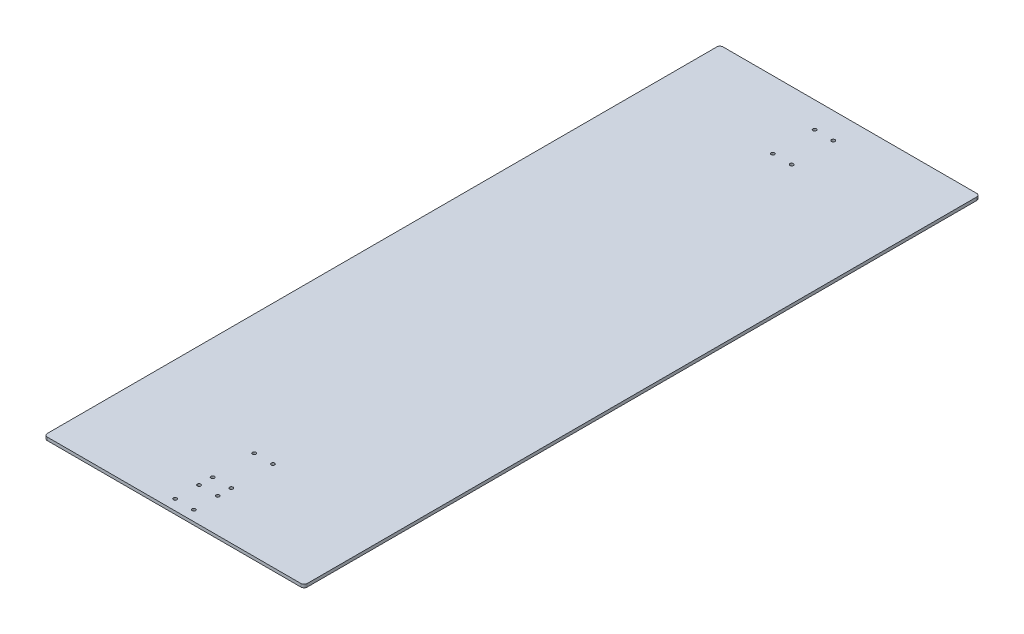
ISO-10303-21;
HEADER;
FILE_DESCRIPTION(('STEP AP214'),'2;1');
FILE_NAME('part.step','',(''),(''),'','','');
FILE_SCHEMA(('AUTOMOTIVE_DESIGN { 1 0 10303 214 1 1 1 1 }'));
ENDSEC;
DATA;
#1=APPLICATION_CONTEXT('core data for automotive mechanical design processes');
#2=APPLICATION_PROTOCOL_DEFINITION('international standard','automotive_design',2000,#1);
#3=PRODUCT_CONTEXT('',#1,'mechanical');
#4=PRODUCT('Part','Part','',(#3));
#5=PRODUCT_RELATED_PRODUCT_CATEGORY('part','',(#4));
#6=PRODUCT_DEFINITION_FORMATION('','',#4);
#7=PRODUCT_DEFINITION_CONTEXT('part definition',#1,'design');
#8=PRODUCT_DEFINITION('design','',#6,#7);
#9=PRODUCT_DEFINITION_SHAPE('','',#8);
#10=(LENGTH_UNIT() NAMED_UNIT(*) SI_UNIT(.MILLI.,.METRE.));
#11=(NAMED_UNIT(*) PLANE_ANGLE_UNIT() SI_UNIT($,.RADIAN.));
#12=(NAMED_UNIT(*) SI_UNIT($,.STERADIAN.) SOLID_ANGLE_UNIT());
#13=UNCERTAINTY_MEASURE_WITH_UNIT(LENGTH_MEASURE(1.E-05),#10,'distance_accuracy_value','');
#14=(GEOMETRIC_REPRESENTATION_CONTEXT(3) GLOBAL_UNCERTAINTY_ASSIGNED_CONTEXT((#13)) GLOBAL_UNIT_ASSIGNED_CONTEXT((#10,
#11,#12)) REPRESENTATION_CONTEXT('',''));
#15=CARTESIAN_POINT('',(0.,0.,0.));
#16=DIRECTION('',(0.,0.,1.));
#17=DIRECTION('',(1.,0.,0.));
#18=AXIS2_PLACEMENT_3D('',#15,#16,#17);
#19=CARTESIAN_POINT('',(125.,3.,325.));
#20=DIRECTION('',(-1.,0.,0.));
#21=DIRECTION('',(0.,0.,1.));
#22=AXIS2_PLACEMENT_3D('',#19,#20,#21);
#23=PLANE('',#22);
#24=DIRECTION('',(0.,0.,-1.));
#25=VECTOR('',#24,1.);
#26=CARTESIAN_POINT('',(125.,0.,325.));
#27=LINE('',#26,#25);
#28=CARTESIAN_POINT('',(125.,0.,322.));
#29=VERTEX_POINT('',#28);
#30=CARTESIAN_POINT('',(125.,0.,-322.));
#31=VERTEX_POINT('',#30);
#32=EDGE_CURVE('E143',#29,#31,#27,.T.);
#33=ORIENTED_EDGE('',*,*,#32,.T.);
#34=DIRECTION('',(0.,-1.,0.));
#35=VECTOR('',#34,1.);
#36=CARTESIAN_POINT('',(125.,3.,-322.));
#37=LINE('',#36,#35);
#38=CARTESIAN_POINT('',(125.,3.,-322.));
#39=VERTEX_POINT('',#38);
#40=EDGE_CURVE('E118',#31,#39,#37,.F.);
#41=ORIENTED_EDGE('',*,*,#40,.T.);
#42=DIRECTION('',(0.,0.,-1.));
#43=VECTOR('',#42,1.);
#44=CARTESIAN_POINT('',(125.,3.,325.));
#45=LINE('',#44,#43);
#46=CARTESIAN_POINT('',(125.,3.,322.));
#47=VERTEX_POINT('',#46);
#48=EDGE_CURVE('E152',#47,#39,#45,.T.);
#49=ORIENTED_EDGE('',*,*,#48,.F.);
#50=DIRECTION('',(0.,-1.,0.));
#51=VECTOR('',#50,1.);
#52=CARTESIAN_POINT('',(125.,3.,322.));
#53=LINE('',#52,#51);
#54=EDGE_CURVE('E124',#47,#29,#53,.T.);
#55=ORIENTED_EDGE('',*,*,#54,.T.);
#56=EDGE_LOOP('',(#33,#41,#49,#55));
#57=FACE_BOUND('',#56,.T.);
#58=ADVANCED_FACE('F42',(#57),#23,.F.);
#59=CARTESIAN_POINT('',(-125.,3.,-325.));
#60=DIRECTION('',(0.,0.,1.));
#61=DIRECTION('',(1.,0.,0.));
#62=AXIS2_PLACEMENT_3D('',#59,#60,#61);
#63=PLANE('',#62);
#64=DIRECTION('',(-1.,0.,0.));
#65=VECTOR('',#64,1.);
#66=CARTESIAN_POINT('',(-125.,3.,-325.));
#67=LINE('',#66,#65);
#68=CARTESIAN_POINT('',(122.,3.,-325.));
#69=VERTEX_POINT('',#68);
#70=CARTESIAN_POINT('',(-122.,3.,-325.));
#71=VERTEX_POINT('',#70);
#72=EDGE_CURVE('E135',#69,#71,#67,.T.);
#73=ORIENTED_EDGE('',*,*,#72,.F.);
#74=DIRECTION('',(0.,-1.,0.));
#75=VECTOR('',#74,1.);
#76=CARTESIAN_POINT('',(122.,3.,-325.));
#77=LINE('',#76,#75);
#78=CARTESIAN_POINT('',(122.,0.,-325.));
#79=VERTEX_POINT('',#78);
#80=EDGE_CURVE('E113',#69,#79,#77,.T.);
#81=ORIENTED_EDGE('',*,*,#80,.T.);
#82=DIRECTION('',(-1.,0.,0.));
#83=VECTOR('',#82,1.);
#84=CARTESIAN_POINT('',(-125.,0.,-325.));
#85=LINE('',#84,#83);
#86=CARTESIAN_POINT('',(-122.,0.,-325.));
#87=VERTEX_POINT('',#86);
#88=EDGE_CURVE('E129',#79,#87,#85,.T.);
#89=ORIENTED_EDGE('',*,*,#88,.T.);
#90=DIRECTION('',(0.,-1.,0.));
#91=VECTOR('',#90,1.);
#92=CARTESIAN_POINT('',(-122.,3.,-325.));
#93=LINE('',#92,#91);
#94=EDGE_CURVE('E132',#87,#71,#93,.F.);
#95=ORIENTED_EDGE('',*,*,#94,.T.);
#96=EDGE_LOOP('',(#73,#81,#89,#95));
#97=FACE_BOUND('',#96,.T.);
#98=ADVANCED_FACE('F126',(#97),#63,.F.);
#99=CARTESIAN_POINT('',(-125.,3.,325.));
#100=DIRECTION('',(1.,0.,0.));
#101=DIRECTION('',(0.,0.,-1.));
#102=AXIS2_PLACEMENT_3D('',#99,#100,#101);
#103=PLANE('',#102);
#104=DIRECTION('',(0.,0.,1.));
#105=VECTOR('',#104,1.);
#106=CARTESIAN_POINT('',(-125.,3.,325.));
#107=LINE('',#106,#105);
#108=CARTESIAN_POINT('',(-125.,3.,-322.));
#109=VERTEX_POINT('',#108);
#110=CARTESIAN_POINT('',(-125.,3.,322.));
#111=VERTEX_POINT('',#110);
#112=EDGE_CURVE('E225',#109,#111,#107,.T.);
#113=ORIENTED_EDGE('',*,*,#112,.F.);
#114=DIRECTION('',(0.,-1.,0.));
#115=VECTOR('',#114,1.);
#116=CARTESIAN_POINT('',(-125.,3.,-322.));
#117=LINE('',#116,#115);
#118=CARTESIAN_POINT('',(-125.,0.,-322.));
#119=VERTEX_POINT('',#118);
#120=EDGE_CURVE('E216',#109,#119,#117,.T.);
#121=ORIENTED_EDGE('',*,*,#120,.T.);
#122=DIRECTION('',(0.,0.,1.));
#123=VECTOR('',#122,1.);
#124=CARTESIAN_POINT('',(-125.,0.,325.));
#125=LINE('',#124,#123);
#126=CARTESIAN_POINT('',(-125.,0.,322.));
#127=VERTEX_POINT('',#126);
#128=EDGE_CURVE('E138',#119,#127,#125,.T.);
#129=ORIENTED_EDGE('',*,*,#128,.T.);
#130=DIRECTION('',(0.,-1.,0.));
#131=VECTOR('',#130,1.);
#132=CARTESIAN_POINT('',(-125.,3.,322.));
#133=LINE('',#132,#131);
#134=EDGE_CURVE('E213',#127,#111,#133,.F.);
#135=ORIENTED_EDGE('',*,*,#134,.T.);
#136=EDGE_LOOP('',(#113,#121,#129,#135));
#137=FACE_BOUND('',#136,.T.);
#138=ADVANCED_FACE('F345',(#137),#103,.F.);
#139=CARTESIAN_POINT('',(-125.,3.,325.));
#140=DIRECTION('',(0.,0.,-1.));
#141=DIRECTION('',(-1.,0.,0.));
#142=AXIS2_PLACEMENT_3D('',#139,#140,#141);
#143=PLANE('',#142);
#144=DIRECTION('',(1.,0.,0.));
#145=VECTOR('',#144,1.);
#146=CARTESIAN_POINT('',(-125.,3.,325.));
#147=LINE('',#146,#145);
#148=CARTESIAN_POINT('',(-122.,3.,325.));
#149=VERTEX_POINT('',#148);
#150=CARTESIAN_POINT('',(122.,3.,325.));
#151=VERTEX_POINT('',#150);
#152=EDGE_CURVE('E186',#149,#151,#147,.T.);
#153=ORIENTED_EDGE('',*,*,#152,.F.);
#154=DIRECTION('',(0.,-1.,0.));
#155=VECTOR('',#154,1.);
#156=CARTESIAN_POINT('',(-122.,3.,325.));
#157=LINE('',#156,#155);
#158=CARTESIAN_POINT('',(-122.,0.,325.));
#159=VERTEX_POINT('',#158);
#160=EDGE_CURVE('E11',#149,#159,#157,.T.);
#161=ORIENTED_EDGE('',*,*,#160,.T.);
#162=DIRECTION('',(1.,0.,0.));
#163=VECTOR('',#162,1.);
#164=CARTESIAN_POINT('',(-125.,0.,325.));
#165=LINE('',#164,#163);
#166=CARTESIAN_POINT('',(122.,0.,325.));
#167=VERTEX_POINT('',#166);
#168=EDGE_CURVE('E148',#159,#167,#165,.T.);
#169=ORIENTED_EDGE('',*,*,#168,.T.);
#170=DIRECTION('',(0.,-1.,0.));
#171=VECTOR('',#170,1.);
#172=CARTESIAN_POINT('',(122.,3.,325.));
#173=LINE('',#172,#171);
#174=EDGE_CURVE('E52',#167,#151,#173,.F.);
#175=ORIENTED_EDGE('',*,*,#174,.T.);
#176=EDGE_LOOP('',(#153,#161,#169,#175));
#177=FACE_BOUND('',#176,.T.);
#178=ADVANCED_FACE('F297',(#177),#143,.F.);
#179=CARTESIAN_POINT('',(0.,3.,0.));
#180=DIRECTION('',(0.,-1.,0.));
#181=DIRECTION('',(0.,0.,-1.));
#182=AXIS2_PLACEMENT_3D('',#179,#180,#181);
#183=PLANE('',#182);
#184=CARTESIAN_POINT('',(9.00000000000005,3.,315.));
#185=DIRECTION('',(0.,1.,0.));
#186=DIRECTION('',(0.,0.,1.));
#187=AXIS2_PLACEMENT_3D('',#184,#185,#186);
#188=CIRCLE('',#187,1.65);
#189=CARTESIAN_POINT('',(9.00000000000005,3.,316.65));
#190=VERTEX_POINT('',#189);
#191=EDGE_CURVE('E274',#190,#190,#188,.T.);
#192=ORIENTED_EDGE('',*,*,#191,.F.);
#193=EDGE_LOOP('',(#192));
#194=FACE_BOUND('',#193,.T.);
#195=CARTESIAN_POINT('',(-8.99999999999994,3.,315.));
#196=DIRECTION('',(0.,1.,0.));
#197=DIRECTION('',(0.,0.,1.));
#198=AXIS2_PLACEMENT_3D('',#195,#196,#197);
#199=CIRCLE('',#198,1.65);
#200=CARTESIAN_POINT('',(-8.99999999999994,3.,316.65));
#201=VERTEX_POINT('',#200);
#202=EDGE_CURVE('E281',#201,#201,#199,.T.);
#203=ORIENTED_EDGE('',*,*,#202,.F.);
#204=EDGE_LOOP('',(#203));
#205=FACE_BOUND('',#204,.T.);
#206=CARTESIAN_POINT('',(-8.99999999999995,3.,292.));
#207=DIRECTION('',(0.,1.,0.));
#208=DIRECTION('',(0.,0.,1.));
#209=AXIS2_PLACEMENT_3D('',#206,#207,#208);
#210=CIRCLE('',#209,1.65);
#211=CARTESIAN_POINT('',(-8.99999999999995,3.,293.65));
#212=VERTEX_POINT('',#211);
#213=EDGE_CURVE('E270',#212,#212,#210,.T.);
#214=ORIENTED_EDGE('',*,*,#213,.F.);
#215=EDGE_LOOP('',(#214));
#216=FACE_BOUND('',#215,.T.);
#217=CARTESIAN_POINT('',(9.00000000000005,3.,292.));
#218=DIRECTION('',(0.,1.,0.));
#219=DIRECTION('',(0.,0.,1.));
#220=AXIS2_PLACEMENT_3D('',#217,#218,#219);
#221=CIRCLE('',#220,1.65);
#222=CARTESIAN_POINT('',(9.00000000000005,3.,293.65));
#223=VERTEX_POINT('',#222);
#224=EDGE_CURVE('E263',#223,#223,#221,.T.);
#225=ORIENTED_EDGE('',*,*,#224,.F.);
#226=EDGE_LOOP('',(#225));
#227=FACE_BOUND('',#226,.T.);
#228=CARTESIAN_POINT('',(8.99999999999995,3.,-300.));
#229=DIRECTION('',(0.,1.,0.));
#230=DIRECTION('',(0.,0.,1.));
#231=AXIS2_PLACEMENT_3D('',#228,#229,#230);
#232=CIRCLE('',#231,1.65);
#233=CARTESIAN_POINT('',(8.99999999999995,3.,-298.35));
#234=VERTEX_POINT('',#233);
#235=EDGE_CURVE('E241',#234,#234,#232,.T.);
#236=ORIENTED_EDGE('',*,*,#235,.F.);
#237=EDGE_LOOP('',(#236));
#238=FACE_BOUND('',#237,.T.);
#239=CARTESIAN_POINT('',(-8.99999999999998,3.,239.));
#240=DIRECTION('',(0.,1.,0.));
#241=DIRECTION('',(0.,0.,1.));
#242=AXIS2_PLACEMENT_3D('',#239,#240,#241);
#243=CIRCLE('',#242,1.65000000000001);
#244=CARTESIAN_POINT('',(-8.99999999999998,3.,240.65));
#245=VERTEX_POINT('',#244);
#246=EDGE_CURVE('E239',#245,#245,#243,.T.);
#247=ORIENTED_EDGE('',*,*,#246,.F.);
#248=EDGE_LOOP('',(#247));
#249=FACE_BOUND('',#248,.T.);
#250=CARTESIAN_POINT('',(9.00000000000001,3.,239.));
#251=DIRECTION('',(0.,1.,0.));
#252=DIRECTION('',(0.,0.,1.));
#253=AXIS2_PLACEMENT_3D('',#250,#251,#252);
#254=CIRCLE('',#253,1.65000000000001);
#255=CARTESIAN_POINT('',(9.00000000000001,3.,240.65));
#256=VERTEX_POINT('',#255);
#257=EDGE_CURVE('E233',#256,#256,#254,.T.);
#258=ORIENTED_EDGE('',*,*,#257,.F.);
#259=EDGE_LOOP('',(#258));
#260=FACE_BOUND('',#259,.T.);
#261=CARTESIAN_POINT('',(-8.99999999999998,3.,279.));
#262=DIRECTION('',(0.,1.,0.));
#263=DIRECTION('',(0.,0.,1.));
#264=AXIS2_PLACEMENT_3D('',#261,#262,#263);
#265=CIRCLE('',#264,1.65);
#266=CARTESIAN_POINT('',(-8.99999999999998,3.,280.65));
#267=VERTEX_POINT('',#266);
#268=EDGE_CURVE('E231',#267,#267,#265,.T.);
#269=ORIENTED_EDGE('',*,*,#268,.F.);
#270=EDGE_LOOP('',(#269));
#271=FACE_BOUND('',#270,.T.);
#272=CARTESIAN_POINT('',(-9.00000000000005,3.,-260.));
#273=DIRECTION('',(0.,1.,0.));
#274=DIRECTION('',(0.,0.,1.));
#275=AXIS2_PLACEMENT_3D('',#272,#273,#274);
#276=CIRCLE('',#275,1.65);
#277=CARTESIAN_POINT('',(-9.00000000000005,3.,-258.35));
#278=VERTEX_POINT('',#277);
#279=EDGE_CURVE('E254',#278,#278,#276,.T.);
#280=ORIENTED_EDGE('',*,*,#279,.F.);
#281=EDGE_LOOP('',(#280));
#282=FACE_BOUND('',#281,.T.);
#283=CARTESIAN_POINT('',(8.99999999999995,3.,-260.));
#284=DIRECTION('',(0.,1.,0.));
#285=DIRECTION('',(0.,0.,1.));
#286=AXIS2_PLACEMENT_3D('',#283,#284,#285);
#287=CIRCLE('',#286,1.65);
#288=CARTESIAN_POINT('',(8.99999999999995,3.,-258.35));
#289=VERTEX_POINT('',#288);
#290=EDGE_CURVE('E253',#289,#289,#287,.T.);
#291=ORIENTED_EDGE('',*,*,#290,.F.);
#292=EDGE_LOOP('',(#291));
#293=FACE_BOUND('',#292,.T.);
#294=CARTESIAN_POINT('',(-9.00000000000006,3.,-300.));
#295=DIRECTION('',(0.,1.,0.));
#296=DIRECTION('',(0.,0.,1.));
#297=AXIS2_PLACEMENT_3D('',#294,#295,#296);
#298=CIRCLE('',#297,1.65);
#299=CARTESIAN_POINT('',(-9.00000000000006,3.,-298.35));
#300=VERTEX_POINT('',#299);
#301=EDGE_CURVE('E249',#300,#300,#298,.T.);
#302=ORIENTED_EDGE('',*,*,#301,.F.);
#303=EDGE_LOOP('',(#302));
#304=FACE_BOUND('',#303,.T.);
#305=CARTESIAN_POINT('',(9.00000000000002,3.,279.));
#306=DIRECTION('',(0.,1.,0.));
#307=DIRECTION('',(0.,0.,1.));
#308=AXIS2_PLACEMENT_3D('',#305,#306,#307);
#309=CIRCLE('',#308,1.65);
#310=CARTESIAN_POINT('',(9.00000000000002,3.,280.65));
#311=VERTEX_POINT('',#310);
#312=EDGE_CURVE('E159',#311,#311,#309,.T.);
#313=ORIENTED_EDGE('',*,*,#312,.F.);
#314=EDGE_LOOP('',(#313));
#315=FACE_BOUND('',#314,.T.);
#316=ORIENTED_EDGE('',*,*,#48,.T.);
#317=CARTESIAN_POINT('',(122.,3.,-322.));
#318=DIRECTION('',(0.,-1.,0.));
#319=DIRECTION('',(0.,0.,-1.));
#320=AXIS2_PLACEMENT_3D('',#317,#318,#319);
#321=CIRCLE('',#320,3.);
#322=EDGE_CURVE('E209',#39,#69,#321,.F.);
#323=ORIENTED_EDGE('',*,*,#322,.T.);
#324=ORIENTED_EDGE('',*,*,#72,.T.);
#325=CARTESIAN_POINT('',(-122.,3.,-322.));
#326=DIRECTION('',(0.,-1.,0.));
#327=DIRECTION('',(0.,0.,-1.));
#328=AXIS2_PLACEMENT_3D('',#325,#326,#327);
#329=CIRCLE('',#328,3.);
#330=EDGE_CURVE('E210',#71,#109,#329,.F.);
#331=ORIENTED_EDGE('',*,*,#330,.T.);
#332=ORIENTED_EDGE('',*,*,#112,.T.);
#333=CARTESIAN_POINT('',(-122.,3.,322.));
#334=DIRECTION('',(0.,-1.,0.));
#335=DIRECTION('',(0.,0.,-1.));
#336=AXIS2_PLACEMENT_3D('',#333,#334,#335);
#337=CIRCLE('',#336,3.);
#338=EDGE_CURVE('E67',#111,#149,#337,.F.);
#339=ORIENTED_EDGE('',*,*,#338,.T.);
#340=ORIENTED_EDGE('',*,*,#152,.T.);
#341=CARTESIAN_POINT('',(122.,3.,322.));
#342=DIRECTION('',(0.,-1.,0.));
#343=DIRECTION('',(0.,0.,-1.));
#344=AXIS2_PLACEMENT_3D('',#341,#342,#343);
#345=CIRCLE('',#344,3.);
#346=EDGE_CURVE('E205',#151,#47,#345,.F.);
#347=ORIENTED_EDGE('',*,*,#346,.T.);
#348=EDGE_LOOP('',(#316,#323,#324,#331,#332,#339,#340,#347));
#349=FACE_BOUND('',#348,.T.);
#350=ADVANCED_FACE('F300',(#194,#205,#216,#227,#238,#249,#260,#271,#282,#293,#304,#315,#349),
#183,.F.);
#351=CARTESIAN_POINT('',(0.,0.,0.));
#352=DIRECTION('',(0.,-1.,0.));
#353=DIRECTION('',(0.,0.,-1.));
#354=AXIS2_PLACEMENT_3D('',#351,#352,#353);
#355=PLANE('',#354);
#356=CARTESIAN_POINT('',(9.00000000000005,0.,315.));
#357=DIRECTION('',(0.,1.,0.));
#358=DIRECTION('',(0.,0.,1.));
#359=AXIS2_PLACEMENT_3D('',#356,#357,#358);
#360=CIRCLE('',#359,1.65);
#361=CARTESIAN_POINT('',(9.00000000000005,0.,316.65));
#362=VERTEX_POINT('',#361);
#363=EDGE_CURVE('E271',#362,#362,#360,.T.);
#364=ORIENTED_EDGE('',*,*,#363,.T.);
#365=EDGE_LOOP('',(#364));
#366=FACE_BOUND('',#365,.T.);
#367=CARTESIAN_POINT('',(-8.99999999999994,0.,315.));
#368=DIRECTION('',(0.,1.,0.));
#369=DIRECTION('',(0.,0.,1.));
#370=AXIS2_PLACEMENT_3D('',#367,#368,#369);
#371=CIRCLE('',#370,1.65);
#372=CARTESIAN_POINT('',(-8.99999999999994,0.,316.65));
#373=VERTEX_POINT('',#372);
#374=EDGE_CURVE('E276',#373,#373,#371,.T.);
#375=ORIENTED_EDGE('',*,*,#374,.T.);
#376=EDGE_LOOP('',(#375));
#377=FACE_BOUND('',#376,.T.);
#378=CARTESIAN_POINT('',(-8.99999999999995,0.,292.));
#379=DIRECTION('',(0.,1.,0.));
#380=DIRECTION('',(0.,0.,1.));
#381=AXIS2_PLACEMENT_3D('',#378,#379,#380);
#382=CIRCLE('',#381,1.65);
#383=CARTESIAN_POINT('',(-8.99999999999995,0.,293.65));
#384=VERTEX_POINT('',#383);
#385=EDGE_CURVE('E289',#384,#384,#382,.T.);
#386=ORIENTED_EDGE('',*,*,#385,.T.);
#387=EDGE_LOOP('',(#386));
#388=FACE_BOUND('',#387,.T.);
#389=CARTESIAN_POINT('',(9.00000000000005,0.,292.));
#390=DIRECTION('',(0.,1.,0.));
#391=DIRECTION('',(0.,0.,1.));
#392=AXIS2_PLACEMENT_3D('',#389,#390,#391);
#393=CIRCLE('',#392,1.65);
#394=CARTESIAN_POINT('',(9.00000000000005,0.,293.65));
#395=VERTEX_POINT('',#394);
#396=EDGE_CURVE('E265',#395,#395,#393,.T.);
#397=ORIENTED_EDGE('',*,*,#396,.T.);
#398=EDGE_LOOP('',(#397));
#399=FACE_BOUND('',#398,.T.);
#400=CARTESIAN_POINT('',(8.99999999999995,0.,-300.));
#401=DIRECTION('',(0.,-1.,0.));
#402=DIRECTION('',(0.,0.,-1.));
#403=AXIS2_PLACEMENT_3D('',#400,#401,#402);
#404=CIRCLE('',#403,1.65);
#405=CARTESIAN_POINT('',(8.99999999999995,0.,-301.65));
#406=VERTEX_POINT('',#405);
#407=EDGE_CURVE('E146',#406,#406,#404,.T.);
#408=ORIENTED_EDGE('',*,*,#407,.F.);
#409=EDGE_LOOP('',(#408));
#410=FACE_BOUND('',#409,.T.);
#411=CARTESIAN_POINT('',(-8.99999999999998,0.,239.));
#412=DIRECTION('',(0.,-1.,0.));
#413=DIRECTION('',(0.,0.,-1.));
#414=AXIS2_PLACEMENT_3D('',#411,#412,#413);
#415=CIRCLE('',#414,1.65000000000001);
#416=CARTESIAN_POINT('',(-8.99999999999998,0.,237.35));
#417=VERTEX_POINT('',#416);
#418=EDGE_CURVE('E178',#417,#417,#415,.T.);
#419=ORIENTED_EDGE('',*,*,#418,.F.);
#420=EDGE_LOOP('',(#419));
#421=FACE_BOUND('',#420,.T.);
#422=CARTESIAN_POINT('',(9.00000000000001,0.,239.));
#423=DIRECTION('',(0.,-1.,0.));
#424=DIRECTION('',(0.,0.,-1.));
#425=AXIS2_PLACEMENT_3D('',#422,#423,#424);
#426=CIRCLE('',#425,1.65000000000001);
#427=CARTESIAN_POINT('',(9.00000000000001,0.,237.35));
#428=VERTEX_POINT('',#427);
#429=EDGE_CURVE('E177',#428,#428,#426,.T.);
#430=ORIENTED_EDGE('',*,*,#429,.F.);
#431=EDGE_LOOP('',(#430));
#432=FACE_BOUND('',#431,.T.);
#433=CARTESIAN_POINT('',(-8.99999999999998,0.,279.));
#434=DIRECTION('',(0.,-1.,0.));
#435=DIRECTION('',(0.,0.,-1.));
#436=AXIS2_PLACEMENT_3D('',#433,#434,#435);
#437=CIRCLE('',#436,1.65);
#438=CARTESIAN_POINT('',(-8.99999999999998,0.,277.35));
#439=VERTEX_POINT('',#438);
#440=EDGE_CURVE('E175',#439,#439,#437,.T.);
#441=ORIENTED_EDGE('',*,*,#440,.F.);
#442=EDGE_LOOP('',(#441));
#443=FACE_BOUND('',#442,.T.);
#444=CARTESIAN_POINT('',(-9.00000000000005,0.,-260.));
#445=DIRECTION('',(0.,-1.,0.));
#446=DIRECTION('',(0.,0.,-1.));
#447=AXIS2_PLACEMENT_3D('',#444,#445,#446);
#448=CIRCLE('',#447,1.65);
#449=CARTESIAN_POINT('',(-9.00000000000005,0.,-261.65));
#450=VERTEX_POINT('',#449);
#451=EDGE_CURVE('E169',#450,#450,#448,.T.);
#452=ORIENTED_EDGE('',*,*,#451,.F.);
#453=EDGE_LOOP('',(#452));
#454=FACE_BOUND('',#453,.T.);
#455=CARTESIAN_POINT('',(8.99999999999995,0.,-260.));
#456=DIRECTION('',(0.,-1.,0.));
#457=DIRECTION('',(0.,0.,-1.));
#458=AXIS2_PLACEMENT_3D('',#455,#456,#457);
#459=CIRCLE('',#458,1.65);
#460=CARTESIAN_POINT('',(8.99999999999995,0.,-261.65));
#461=VERTEX_POINT('',#460);
#462=EDGE_CURVE('E163',#461,#461,#459,.T.);
#463=ORIENTED_EDGE('',*,*,#462,.F.);
#464=EDGE_LOOP('',(#463));
#465=FACE_BOUND('',#464,.T.);
#466=CARTESIAN_POINT('',(-9.00000000000006,0.,-300.));
#467=DIRECTION('',(0.,-1.,0.));
#468=DIRECTION('',(0.,0.,-1.));
#469=AXIS2_PLACEMENT_3D('',#466,#467,#468);
#470=CIRCLE('',#469,1.65);
#471=CARTESIAN_POINT('',(-9.00000000000006,0.,-301.65));
#472=VERTEX_POINT('',#471);
#473=EDGE_CURVE('E157',#472,#472,#470,.T.);
#474=ORIENTED_EDGE('',*,*,#473,.F.);
#475=EDGE_LOOP('',(#474));
#476=FACE_BOUND('',#475,.T.);
#477=CARTESIAN_POINT('',(9.00000000000002,0.,279.));
#478=DIRECTION('',(0.,-1.,0.));
#479=DIRECTION('',(0.,0.,-1.));
#480=AXIS2_PLACEMENT_3D('',#477,#478,#479);
#481=CIRCLE('',#480,1.65);
#482=CARTESIAN_POINT('',(9.00000000000002,0.,277.35));
#483=VERTEX_POINT('',#482);
#484=EDGE_CURVE('E154',#483,#483,#481,.T.);
#485=ORIENTED_EDGE('',*,*,#484,.F.);
#486=EDGE_LOOP('',(#485));
#487=FACE_BOUND('',#486,.T.);
#488=ORIENTED_EDGE('',*,*,#88,.F.);
#489=CARTESIAN_POINT('',(122.,0.,-322.));
#490=DIRECTION('',(0.,-1.,0.));
#491=DIRECTION('',(0.,0.,-1.));
#492=AXIS2_PLACEMENT_3D('',#489,#490,#491);
#493=CIRCLE('',#492,3.);
#494=EDGE_CURVE('E112',#79,#31,#493,.T.);
#495=ORIENTED_EDGE('',*,*,#494,.T.);
#496=ORIENTED_EDGE('',*,*,#32,.F.);
#497=CARTESIAN_POINT('',(122.,0.,322.));
#498=DIRECTION('',(0.,-1.,0.));
#499=DIRECTION('',(0.,0.,-1.));
#500=AXIS2_PLACEMENT_3D('',#497,#498,#499);
#501=CIRCLE('',#500,3.);
#502=EDGE_CURVE('E134',#29,#167,#501,.T.);
#503=ORIENTED_EDGE('',*,*,#502,.T.);
#504=ORIENTED_EDGE('',*,*,#168,.F.);
#505=CARTESIAN_POINT('',(-122.,0.,322.));
#506=DIRECTION('',(0.,-1.,0.));
#507=DIRECTION('',(0.,0.,-1.));
#508=AXIS2_PLACEMENT_3D('',#505,#506,#507);
#509=CIRCLE('',#508,3.);
#510=EDGE_CURVE('E194',#159,#127,#509,.T.);
#511=ORIENTED_EDGE('',*,*,#510,.T.);
#512=ORIENTED_EDGE('',*,*,#128,.F.);
#513=CARTESIAN_POINT('',(-122.,0.,-322.));
#514=DIRECTION('',(0.,-1.,0.));
#515=DIRECTION('',(0.,0.,-1.));
#516=AXIS2_PLACEMENT_3D('',#513,#514,#515);
#517=CIRCLE('',#516,3.);
#518=EDGE_CURVE('E125',#119,#87,#517,.T.);
#519=ORIENTED_EDGE('',*,*,#518,.T.);
#520=EDGE_LOOP('',(#488,#495,#496,#503,#504,#511,#512,#519));
#521=FACE_BOUND('',#520,.T.);
#522=ADVANCED_FACE('F139',(#366,#377,#388,#399,#410,#421,#432,#443,#454,#465,#476,#487,#521),
#355,.T.);
#523=CARTESIAN_POINT('',(9.00000000000002,-7.,279.));
#524=DIRECTION('',(0.,1.,0.));
#525=DIRECTION('',(0.,0.,1.));
#526=AXIS2_PLACEMENT_3D('',#523,#524,#525);
#527=CYLINDRICAL_SURFACE('',#526,1.65);
#528=ORIENTED_EDGE('',*,*,#484,.T.);
#529=EDGE_LOOP('',(#528));
#530=FACE_BOUND('',#529,.T.);
#531=ORIENTED_EDGE('',*,*,#312,.T.);
#532=EDGE_LOOP('',(#531));
#533=FACE_BOUND('',#532,.T.);
#534=ADVANCED_FACE('F321',(#530,#533),#527,.F.);
#535=CARTESIAN_POINT('',(-9.00000000000006,-7.,-300.));
#536=DIRECTION('',(0.,1.,0.));
#537=DIRECTION('',(0.,0.,1.));
#538=AXIS2_PLACEMENT_3D('',#535,#536,#537);
#539=CYLINDRICAL_SURFACE('',#538,1.65);
#540=ORIENTED_EDGE('',*,*,#473,.T.);
#541=EDGE_LOOP('',(#540));
#542=FACE_BOUND('',#541,.T.);
#543=ORIENTED_EDGE('',*,*,#301,.T.);
#544=EDGE_LOOP('',(#543));
#545=FACE_BOUND('',#544,.T.);
#546=ADVANCED_FACE('F323',(#542,#545),#539,.F.);
#547=CARTESIAN_POINT('',(8.99999999999995,-7.,-260.));
#548=DIRECTION('',(0.,1.,0.));
#549=DIRECTION('',(0.,0.,1.));
#550=AXIS2_PLACEMENT_3D('',#547,#548,#549);
#551=CYLINDRICAL_SURFACE('',#550,1.65);
#552=ORIENTED_EDGE('',*,*,#462,.T.);
#553=EDGE_LOOP('',(#552));
#554=FACE_BOUND('',#553,.T.);
#555=ORIENTED_EDGE('',*,*,#290,.T.);
#556=EDGE_LOOP('',(#555));
#557=FACE_BOUND('',#556,.T.);
#558=ADVANCED_FACE('F328',(#554,#557),#551,.F.);
#559=CARTESIAN_POINT('',(-9.00000000000005,-7.,-260.));
#560=DIRECTION('',(0.,1.,0.));
#561=DIRECTION('',(0.,0.,1.));
#562=AXIS2_PLACEMENT_3D('',#559,#560,#561);
#563=CYLINDRICAL_SURFACE('',#562,1.65);
#564=ORIENTED_EDGE('',*,*,#451,.T.);
#565=EDGE_LOOP('',(#564));
#566=FACE_BOUND('',#565,.T.);
#567=ORIENTED_EDGE('',*,*,#279,.T.);
#568=EDGE_LOOP('',(#567));
#569=FACE_BOUND('',#568,.T.);
#570=ADVANCED_FACE('F478',(#566,#569),#563,.F.);
#571=CARTESIAN_POINT('',(-8.99999999999998,-7.,279.));
#572=DIRECTION('',(0.,1.,0.));
#573=DIRECTION('',(0.,0.,1.));
#574=AXIS2_PLACEMENT_3D('',#571,#572,#573);
#575=CYLINDRICAL_SURFACE('',#574,1.65);
#576=ORIENTED_EDGE('',*,*,#440,.T.);
#577=EDGE_LOOP('',(#576));
#578=FACE_BOUND('',#577,.T.);
#579=ORIENTED_EDGE('',*,*,#268,.T.);
#580=EDGE_LOOP('',(#579));
#581=FACE_BOUND('',#580,.T.);
#582=ADVANCED_FACE('F470',(#578,#581),#575,.F.);
#583=CARTESIAN_POINT('',(9.00000000000001,-7.,239.));
#584=DIRECTION('',(0.,1.,0.));
#585=DIRECTION('',(0.,0.,1.));
#586=AXIS2_PLACEMENT_3D('',#583,#584,#585);
#587=CYLINDRICAL_SURFACE('',#586,1.65000000000001);
#588=ORIENTED_EDGE('',*,*,#429,.T.);
#589=EDGE_LOOP('',(#588));
#590=FACE_BOUND('',#589,.T.);
#591=ORIENTED_EDGE('',*,*,#257,.T.);
#592=EDGE_LOOP('',(#591));
#593=FACE_BOUND('',#592,.T.);
#594=ADVANCED_FACE('F459',(#590,#593),#587,.F.);
#595=CARTESIAN_POINT('',(-8.99999999999998,-7.,239.));
#596=DIRECTION('',(0.,1.,0.));
#597=DIRECTION('',(0.,0.,1.));
#598=AXIS2_PLACEMENT_3D('',#595,#596,#597);
#599=CYLINDRICAL_SURFACE('',#598,1.65000000000001);
#600=ORIENTED_EDGE('',*,*,#418,.T.);
#601=EDGE_LOOP('',(#600));
#602=FACE_BOUND('',#601,.T.);
#603=ORIENTED_EDGE('',*,*,#246,.T.);
#604=EDGE_LOOP('',(#603));
#605=FACE_BOUND('',#604,.T.);
#606=ADVANCED_FACE('F447',(#602,#605),#599,.F.);
#607=CARTESIAN_POINT('',(8.99999999999995,-7.,-300.));
#608=DIRECTION('',(0.,1.,0.));
#609=DIRECTION('',(0.,0.,1.));
#610=AXIS2_PLACEMENT_3D('',#607,#608,#609);
#611=CYLINDRICAL_SURFACE('',#610,1.65);
#612=ORIENTED_EDGE('',*,*,#407,.T.);
#613=EDGE_LOOP('',(#612));
#614=FACE_BOUND('',#613,.T.);
#615=ORIENTED_EDGE('',*,*,#235,.T.);
#616=EDGE_LOOP('',(#615));
#617=FACE_BOUND('',#616,.T.);
#618=ADVANCED_FACE('F442',(#614,#617),#611,.F.);
#619=CARTESIAN_POINT('',(9.00000000000005,0.,292.));
#620=DIRECTION('',(0.,1.,0.));
#621=DIRECTION('',(0.,0.,1.));
#622=AXIS2_PLACEMENT_3D('',#619,#620,#621);
#623=CYLINDRICAL_SURFACE('',#622,1.65);
#624=ORIENTED_EDGE('',*,*,#396,.F.);
#625=EDGE_LOOP('',(#624));
#626=FACE_BOUND('',#625,.T.);
#627=ORIENTED_EDGE('',*,*,#224,.T.);
#628=EDGE_LOOP('',(#627));
#629=FACE_BOUND('',#628,.T.);
#630=ADVANCED_FACE('F435',(#626,#629),#623,.F.);
#631=CARTESIAN_POINT('',(-8.99999999999995,0.,292.));
#632=DIRECTION('',(0.,1.,0.));
#633=DIRECTION('',(0.,0.,1.));
#634=AXIS2_PLACEMENT_3D('',#631,#632,#633);
#635=CYLINDRICAL_SURFACE('',#634,1.65);
#636=ORIENTED_EDGE('',*,*,#385,.F.);
#637=EDGE_LOOP('',(#636));
#638=FACE_BOUND('',#637,.T.);
#639=ORIENTED_EDGE('',*,*,#213,.T.);
#640=EDGE_LOOP('',(#639));
#641=FACE_BOUND('',#640,.T.);
#642=ADVANCED_FACE('F293',(#638,#641),#635,.F.);
#643=CARTESIAN_POINT('',(-8.99999999999994,0.,315.));
#644=DIRECTION('',(0.,1.,0.));
#645=DIRECTION('',(0.,0.,1.));
#646=AXIS2_PLACEMENT_3D('',#643,#644,#645);
#647=CYLINDRICAL_SURFACE('',#646,1.65);
#648=ORIENTED_EDGE('',*,*,#374,.F.);
#649=EDGE_LOOP('',(#648));
#650=FACE_BOUND('',#649,.T.);
#651=ORIENTED_EDGE('',*,*,#202,.T.);
#652=EDGE_LOOP('',(#651));
#653=FACE_BOUND('',#652,.T.);
#654=ADVANCED_FACE('F413',(#650,#653),#647,.F.);
#655=CARTESIAN_POINT('',(9.00000000000005,0.,315.));
#656=DIRECTION('',(0.,1.,0.));
#657=DIRECTION('',(0.,0.,1.));
#658=AXIS2_PLACEMENT_3D('',#655,#656,#657);
#659=CYLINDRICAL_SURFACE('',#658,1.65);
#660=ORIENTED_EDGE('',*,*,#363,.F.);
#661=EDGE_LOOP('',(#660));
#662=FACE_BOUND('',#661,.T.);
#663=ORIENTED_EDGE('',*,*,#191,.T.);
#664=EDGE_LOOP('',(#663));
#665=FACE_BOUND('',#664,.T.);
#666=ADVANCED_FACE('F348',(#662,#665),#659,.F.);
#667=CARTESIAN_POINT('',(122.,3.,-322.));
#668=DIRECTION('',(0.,-1.,0.));
#669=DIRECTION('',(0.,0.,-1.));
#670=AXIS2_PLACEMENT_3D('',#667,#668,#669);
#671=CYLINDRICAL_SURFACE('',#670,3.);
#672=ORIENTED_EDGE('',*,*,#322,.F.);
#673=ORIENTED_EDGE('',*,*,#40,.F.);
#674=ORIENTED_EDGE('',*,*,#494,.F.);
#675=ORIENTED_EDGE('',*,*,#80,.F.);
#676=EDGE_LOOP('',(#672,#673,#674,#675));
#677=FACE_BOUND('',#676,.T.);
#678=ADVANCED_FACE('F111',(#677),#671,.T.);
#679=CARTESIAN_POINT('',(-122.,3.,-322.));
#680=DIRECTION('',(0.,-1.,0.));
#681=DIRECTION('',(0.,0.,-1.));
#682=AXIS2_PLACEMENT_3D('',#679,#680,#681);
#683=CYLINDRICAL_SURFACE('',#682,3.);
#684=ORIENTED_EDGE('',*,*,#330,.F.);
#685=ORIENTED_EDGE('',*,*,#94,.F.);
#686=ORIENTED_EDGE('',*,*,#518,.F.);
#687=ORIENTED_EDGE('',*,*,#120,.F.);
#688=EDGE_LOOP('',(#684,#685,#686,#687));
#689=FACE_BOUND('',#688,.T.);
#690=ADVANCED_FACE('F349',(#689),#683,.T.);
#691=CARTESIAN_POINT('',(-122.,3.,322.));
#692=DIRECTION('',(0.,-1.,0.));
#693=DIRECTION('',(0.,0.,-1.));
#694=AXIS2_PLACEMENT_3D('',#691,#692,#693);
#695=CYLINDRICAL_SURFACE('',#694,3.);
#696=ORIENTED_EDGE('',*,*,#338,.F.);
#697=ORIENTED_EDGE('',*,*,#134,.F.);
#698=ORIENTED_EDGE('',*,*,#510,.F.);
#699=ORIENTED_EDGE('',*,*,#160,.F.);
#700=EDGE_LOOP('',(#696,#697,#698,#699));
#701=FACE_BOUND('',#700,.T.);
#702=ADVANCED_FACE('F355',(#701),#695,.T.);
#703=CARTESIAN_POINT('',(122.,3.,322.));
#704=DIRECTION('',(0.,-1.,0.));
#705=DIRECTION('',(0.,0.,-1.));
#706=AXIS2_PLACEMENT_3D('',#703,#704,#705);
#707=CYLINDRICAL_SURFACE('',#706,3.);
#708=ORIENTED_EDGE('',*,*,#346,.F.);
#709=ORIENTED_EDGE('',*,*,#174,.F.);
#710=ORIENTED_EDGE('',*,*,#502,.F.);
#711=ORIENTED_EDGE('',*,*,#54,.F.);
#712=EDGE_LOOP('',(#708,#709,#710,#711));
#713=FACE_BOUND('',#712,.T.);
#714=ADVANCED_FACE('F46',(#713),#707,.T.);
#715=CLOSED_SHELL('',(#58,#98,#138,#178,#350,#522,#534,#546,#558,#570,#582,#594,#606,#618,#630,
#642,#654,#666,#678,#690,#702,#714));
#716=MANIFOLD_SOLID_BREP('B2',#715);
#717=ADVANCED_BREP_SHAPE_REPRESENTATION('',(#18,#716),#14);
#718=SHAPE_DEFINITION_REPRESENTATION(#9,#717);
ENDSEC;
END-ISO-10303-21;
